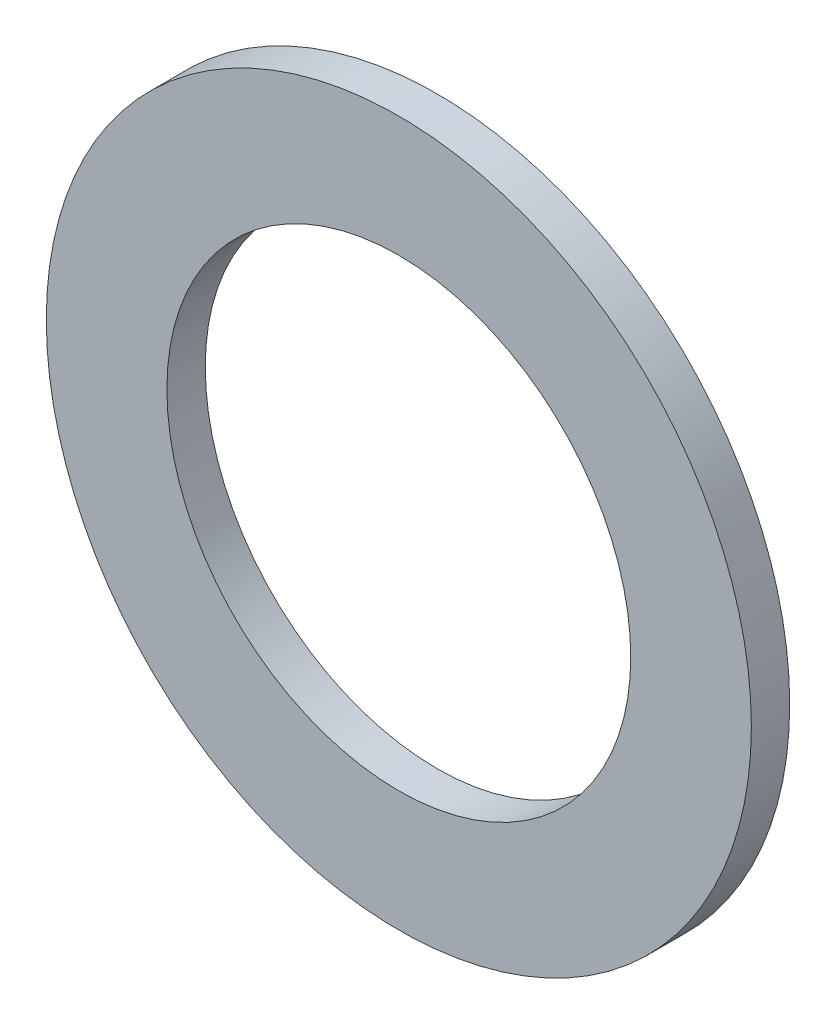
ISO-10303-21;
HEADER;
FILE_DESCRIPTION(('STEP AP214'),'2;1');
FILE_NAME('part.step','',(''),(''),'','','');
FILE_SCHEMA(('AUTOMOTIVE_DESIGN { 1 0 10303 214 1 1 1 1 }'));
ENDSEC;
DATA;
#1=APPLICATION_CONTEXT('core data for automotive mechanical design processes');
#2=APPLICATION_PROTOCOL_DEFINITION('international standard','automotive_design',2000,#1);
#3=PRODUCT_CONTEXT('',#1,'mechanical');
#4=PRODUCT('Part','Part','',(#3));
#5=PRODUCT_RELATED_PRODUCT_CATEGORY('part','',(#4));
#6=PRODUCT_DEFINITION_FORMATION('','',#4);
#7=PRODUCT_DEFINITION_CONTEXT('part definition',#1,'design');
#8=PRODUCT_DEFINITION('design','',#6,#7);
#9=PRODUCT_DEFINITION_SHAPE('','',#8);
#10=(LENGTH_UNIT() NAMED_UNIT(*) SI_UNIT(.MILLI.,.METRE.));
#11=(NAMED_UNIT(*) PLANE_ANGLE_UNIT() SI_UNIT($,.RADIAN.));
#12=(NAMED_UNIT(*) SI_UNIT($,.STERADIAN.) SOLID_ANGLE_UNIT());
#13=UNCERTAINTY_MEASURE_WITH_UNIT(LENGTH_MEASURE(1.E-05),#10,'distance_accuracy_value','');
#14=(GEOMETRIC_REPRESENTATION_CONTEXT(3) GLOBAL_UNCERTAINTY_ASSIGNED_CONTEXT((#13)) GLOBAL_UNIT_ASSIGNED_CONTEXT((#10,
#11,#12)) REPRESENTATION_CONTEXT('',''));
#15=CARTESIAN_POINT('',(0.,0.,0.));
#16=DIRECTION('',(0.,0.,1.));
#17=DIRECTION('',(1.,0.,0.));
#18=AXIS2_PLACEMENT_3D('',#15,#16,#17);
#19=CARTESIAN_POINT('',(0.,0.,0.3937));
#20=DIRECTION('',(0.,0.,1.));
#21=DIRECTION('',(1.,0.,0.));
#22=AXIS2_PLACEMENT_3D('',#19,#20,#21);
#23=PLANE('',#22);
#24=CARTESIAN_POINT('',(0.,0.,0.3937));
#25=DIRECTION('',(0.,0.,1.));
#26=DIRECTION('',(1.,0.,0.));
#27=AXIS2_PLACEMENT_3D('',#24,#25,#26);
#28=CIRCLE('',#27,7.239);
#29=CARTESIAN_POINT('',(7.239,0.,0.3937));
#30=VERTEX_POINT('',#29);
#31=EDGE_CURVE('E10',#30,#30,#28,.T.);
#32=ORIENTED_EDGE('',*,*,#31,.T.);
#33=EDGE_LOOP('',(#32));
#34=FACE_BOUND('',#33,.T.);
#35=CARTESIAN_POINT('',(0.,0.,0.3937));
#36=DIRECTION('',(0.,0.,1.));
#37=DIRECTION('',(1.,0.,0.));
#38=AXIS2_PLACEMENT_3D('',#35,#36,#37);
#39=CIRCLE('',#38,4.7625);
#40=CARTESIAN_POINT('',(4.7625,0.,0.3937));
#41=VERTEX_POINT('',#40);
#42=EDGE_CURVE('E41',#41,#41,#39,.T.);
#43=ORIENTED_EDGE('',*,*,#42,.F.);
#44=EDGE_LOOP('',(#43));
#45=FACE_BOUND('',#44,.T.);
#46=ADVANCED_FACE('F30',(#34,#45),#23,.T.);
#47=CARTESIAN_POINT('',(0.,0.,-0.3937));
#48=DIRECTION('',(0.,0.,1.));
#49=DIRECTION('',(1.,0.,0.));
#50=AXIS2_PLACEMENT_3D('',#47,#48,#49);
#51=PLANE('',#50);
#52=CARTESIAN_POINT('',(0.,0.,-0.3937));
#53=DIRECTION('',(0.,0.,1.));
#54=DIRECTION('',(1.,0.,0.));
#55=AXIS2_PLACEMENT_3D('',#52,#53,#54);
#56=CIRCLE('',#55,7.239);
#57=CARTESIAN_POINT('',(7.239,0.,-0.3937));
#58=VERTEX_POINT('',#57);
#59=EDGE_CURVE('E34',#58,#58,#56,.T.);
#60=ORIENTED_EDGE('',*,*,#59,.F.);
#61=EDGE_LOOP('',(#60));
#62=FACE_BOUND('',#61,.T.);
#63=CARTESIAN_POINT('',(0.,0.,-0.3937));
#64=DIRECTION('',(0.,0.,1.));
#65=DIRECTION('',(1.,0.,0.));
#66=AXIS2_PLACEMENT_3D('',#63,#64,#65);
#67=CIRCLE('',#66,4.7625);
#68=CARTESIAN_POINT('',(4.7625,0.,-0.3937));
#69=VERTEX_POINT('',#68);
#70=EDGE_CURVE('E43',#69,#69,#67,.T.);
#71=ORIENTED_EDGE('',*,*,#70,.T.);
#72=EDGE_LOOP('',(#71));
#73=FACE_BOUND('',#72,.T.);
#74=ADVANCED_FACE('F53',(#62,#73),#51,.F.);
#75=CARTESIAN_POINT('',(0.,0.,0.3937));
#76=DIRECTION('',(0.,0.,-1.));
#77=DIRECTION('',(-1.,0.,0.));
#78=AXIS2_PLACEMENT_3D('',#75,#76,#77);
#79=CYLINDRICAL_SURFACE('',#78,7.239);
#80=ORIENTED_EDGE('',*,*,#31,.F.);
#81=EDGE_LOOP('',(#80));
#82=FACE_BOUND('',#81,.T.);
#83=ORIENTED_EDGE('',*,*,#59,.T.);
#84=EDGE_LOOP('',(#83));
#85=FACE_BOUND('',#84,.T.);
#86=ADVANCED_FACE('F32',(#82,#85),#79,.T.);
#87=CARTESIAN_POINT('',(0.,0.,0.3937));
#88=DIRECTION('',(0.,0.,-1.));
#89=DIRECTION('',(-1.,0.,0.));
#90=AXIS2_PLACEMENT_3D('',#87,#88,#89);
#91=CYLINDRICAL_SURFACE('',#90,4.7625);
#92=ORIENTED_EDGE('',*,*,#42,.T.);
#93=EDGE_LOOP('',(#92));
#94=FACE_BOUND('',#93,.T.);
#95=ORIENTED_EDGE('',*,*,#70,.F.);
#96=EDGE_LOOP('',(#95));
#97=FACE_BOUND('',#96,.T.);
#98=ADVANCED_FACE('F49',(#94,#97),#91,.F.);
#99=CLOSED_SHELL('',(#46,#74,#86,#98));
#100=MANIFOLD_SOLID_BREP('B2',#99);
#101=ADVANCED_BREP_SHAPE_REPRESENTATION('',(#18,#100),#14);
#102=SHAPE_DEFINITION_REPRESENTATION(#9,#101);
ENDSEC;
END-ISO-10303-21;
